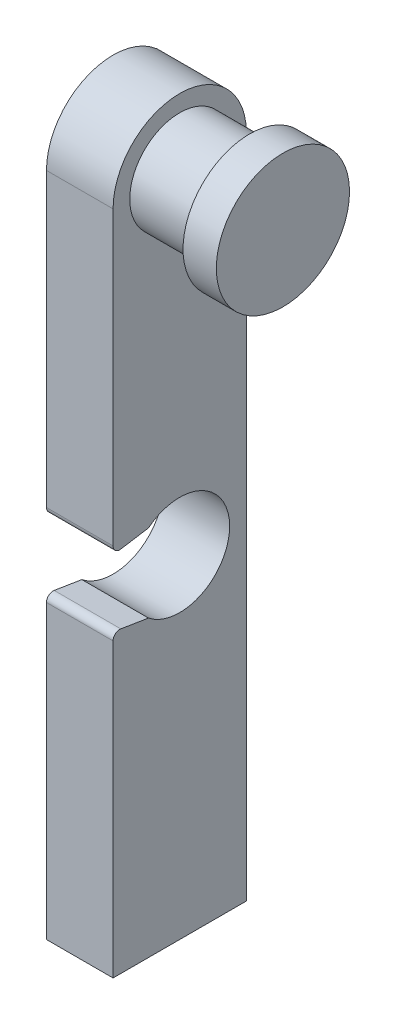
ISO-10303-21;
HEADER;
FILE_DESCRIPTION(('STEP AP214'),'2;1');
FILE_NAME('part.step','',(''),(''),'','','');
FILE_SCHEMA(('AUTOMOTIVE_DESIGN { 1 0 10303 214 1 1 1 1 }'));
ENDSEC;
DATA;
#1=APPLICATION_CONTEXT('core data for automotive mechanical design processes');
#2=APPLICATION_PROTOCOL_DEFINITION('international standard','automotive_design',2000,#1);
#3=PRODUCT_CONTEXT('',#1,'mechanical');
#4=PRODUCT('Part','Part','',(#3));
#5=PRODUCT_RELATED_PRODUCT_CATEGORY('part','',(#4));
#6=PRODUCT_DEFINITION_FORMATION('','',#4);
#7=PRODUCT_DEFINITION_CONTEXT('part definition',#1,'design');
#8=PRODUCT_DEFINITION('design','',#6,#7);
#9=PRODUCT_DEFINITION_SHAPE('','',#8);
#10=(LENGTH_UNIT() NAMED_UNIT(*) SI_UNIT(.MILLI.,.METRE.));
#11=(NAMED_UNIT(*) PLANE_ANGLE_UNIT() SI_UNIT($,.RADIAN.));
#12=(NAMED_UNIT(*) SI_UNIT($,.STERADIAN.) SOLID_ANGLE_UNIT());
#13=UNCERTAINTY_MEASURE_WITH_UNIT(LENGTH_MEASURE(1.E-05),#10,'distance_accuracy_value','');
#14=(GEOMETRIC_REPRESENTATION_CONTEXT(3) GLOBAL_UNCERTAINTY_ASSIGNED_CONTEXT((#13)) GLOBAL_UNIT_ASSIGNED_CONTEXT((#10,
#11,#12)) REPRESENTATION_CONTEXT('',''));
#15=CARTESIAN_POINT('',(0.,0.,0.));
#16=DIRECTION('',(0.,0.,1.));
#17=DIRECTION('',(1.,0.,0.));
#18=AXIS2_PLACEMENT_3D('',#15,#16,#17);
#19=CARTESIAN_POINT('',(2.,10.,2.));
#20=DIRECTION('',(0.,0.,-1.));
#21=DIRECTION('',(0.,1.,0.));
#22=AXIS2_PLACEMENT_3D('',#19,#20,#21);
#23=PLANE('',#22);
#24=DIRECTION('',(0.,-1.,0.));
#25=VECTOR('',#24,1.);
#26=CARTESIAN_POINT('',(2.,10.,2.));
#27=LINE('',#26,#25);
#28=CARTESIAN_POINT('',(2.,-1.23481195037375,2.));
#29=VERTEX_POINT('',#28);
#30=CARTESIAN_POINT('',(2.,-9.99999999999997,2.));
#31=VERTEX_POINT('',#30);
#32=EDGE_CURVE('E160',#29,#31,#27,.T.);
#33=ORIENTED_EDGE('',*,*,#32,.F.);
#34=DIRECTION('',(-1.,0.,0.));
#35=VECTOR('',#34,1.);
#36=CARTESIAN_POINT('',(2.,-1.23481195037375,2.));
#37=LINE('',#36,#35);
#38=CARTESIAN_POINT('',(0.,-1.23481195037375,2.));
#39=VERTEX_POINT('',#38);
#40=EDGE_CURVE('E186',#29,#39,#37,.T.);
#41=ORIENTED_EDGE('',*,*,#40,.T.);
#42=DIRECTION('',(0.,-1.,0.));
#43=VECTOR('',#42,1.);
#44=CARTESIAN_POINT('',(0.,10.,2.));
#45=LINE('',#44,#43);
#46=CARTESIAN_POINT('',(0.,-9.99999999999997,2.));
#47=VERTEX_POINT('',#46);
#48=EDGE_CURVE('E154',#39,#47,#45,.T.);
#49=ORIENTED_EDGE('',*,*,#48,.T.);
#50=DIRECTION('',(-1.,0.,0.));
#51=VECTOR('',#50,1.);
#52=CARTESIAN_POINT('',(2.,-9.99999999999997,2.));
#53=LINE('',#52,#51);
#54=EDGE_CURVE('E183',#31,#47,#53,.T.);
#55=ORIENTED_EDGE('',*,*,#54,.F.);
#56=EDGE_LOOP('',(#33,#41,#49,#55));
#57=FACE_BOUND('',#56,.T.);
#58=ADVANCED_FACE('F33',(#57),#23,.F.);
#59=CARTESIAN_POINT('',(2.,10.,0.));
#60=DIRECTION('',(1.,0.,0.));
#61=DIRECTION('',(0.,0.,-1.));
#62=AXIS2_PLACEMENT_3D('',#59,#60,#61);
#63=PLANE('',#62);
#64=DIRECTION('',(0.,0.159104316938012,0.987261777003287));
#65=VECTOR('',#64,1.);
#66=CARTESIAN_POINT('',(2.,-1.17130321416454,0.937042571331637));
#67=LINE('',#66,#65);
#68=CARTESIAN_POINT('',(2.,-1.17130321416454,0.937042571331637));
#69=VERTEX_POINT('',#68);
#70=CARTESIAN_POINT('',(2.,-1.03735959497309,1.7681791366124));
#71=VERTEX_POINT('',#70);
#72=EDGE_CURVE('E117',#69,#71,#67,.T.);
#73=ORIENTED_EDGE('',*,*,#72,.T.);
#74=CARTESIAN_POINT('',(2.,-1.23481195037375,1.8));
#75=DIRECTION('',(1.,0.,0.));
#76=DIRECTION('',(0.,0.,-1.));
#77=AXIS2_PLACEMENT_3D('',#74,#75,#76);
#78=CIRCLE('',#77,0.2);
#79=EDGE_CURVE('E195',#71,#29,#78,.T.);
#80=ORIENTED_EDGE('',*,*,#79,.T.);
#81=ORIENTED_EDGE('',*,*,#32,.T.);
#82=DIRECTION('',(0.,0.,-1.));
#83=VECTOR('',#82,1.);
#84=CARTESIAN_POINT('',(2.,-9.99999999999997,-2.));
#85=LINE('',#84,#83);
#86=CARTESIAN_POINT('',(2.,-9.99999999999997,-2.));
#87=VERTEX_POINT('',#86);
#88=EDGE_CURVE('E159',#31,#87,#85,.T.);
#89=ORIENTED_EDGE('',*,*,#88,.T.);
#90=DIRECTION('',(0.,1.,0.));
#91=VECTOR('',#90,1.);
#92=CARTESIAN_POINT('',(2.,10.,-2.));
#93=LINE('',#92,#91);
#94=CARTESIAN_POINT('',(2.,10.,-2.));
#95=VERTEX_POINT('',#94);
#96=EDGE_CURVE('E162',#87,#95,#93,.T.);
#97=ORIENTED_EDGE('',*,*,#96,.T.);
#98=CARTESIAN_POINT('',(2.,10.,0.));
#99=DIRECTION('',(1.,0.,0.));
#100=DIRECTION('',(0.,0.,-1.));
#101=AXIS2_PLACEMENT_3D('',#98,#99,#100);
#102=CIRCLE('',#101,2.);
#103=CARTESIAN_POINT('',(2.,10.,2.));
#104=VERTEX_POINT('',#103);
#105=EDGE_CURVE('E164',#95,#104,#102,.T.);
#106=ORIENTED_EDGE('',*,*,#105,.T.);
#107=CARTESIAN_POINT('',(2.,1.23481195037377,2.));
#108=VERTEX_POINT('',#107);
#109=EDGE_CURVE('E157',#104,#108,#27,.T.);
#110=ORIENTED_EDGE('',*,*,#109,.T.);
#111=CARTESIAN_POINT('',(2.,1.23481195037377,1.8));
#112=DIRECTION('',(1.,0.,0.));
#113=DIRECTION('',(0.,0.,-1.));
#114=AXIS2_PLACEMENT_3D('',#111,#112,#113);
#115=CIRCLE('',#114,0.2);
#116=CARTESIAN_POINT('',(2.,1.03735959497311,1.7681791366124));
#117=VERTEX_POINT('',#116);
#118=EDGE_CURVE('E48',#108,#117,#115,.T.);
#119=ORIENTED_EDGE('',*,*,#118,.T.);
#120=DIRECTION('',(0.,0.159104316938015,-0.987261777003287));
#121=VECTOR('',#120,1.);
#122=CARTESIAN_POINT('',(2.,1.00000000000001,2.));
#123=LINE('',#122,#121);
#124=CARTESIAN_POINT('',(2.,1.17130321416456,0.937042571331632));
#125=VERTEX_POINT('',#124);
#126=EDGE_CURVE('E141',#117,#125,#123,.T.);
#127=ORIENTED_EDGE('',*,*,#126,.T.);
#128=CARTESIAN_POINT('',(2.,0.,0.));
#129=DIRECTION('',(1.,0.,0.));
#130=DIRECTION('',(0.,0.,-1.));
#131=AXIS2_PLACEMENT_3D('',#128,#129,#130);
#132=CIRCLE('',#131,1.5);
#133=EDGE_CURVE('E122',#125,#69,#132,.F.);
#134=ORIENTED_EDGE('',*,*,#133,.T.);
#135=EDGE_LOOP('',(#73,#80,#81,#89,#97,#106,#110,#119,#127,#134));
#136=FACE_BOUND('',#135,.T.);
#137=CARTESIAN_POINT('',(2.,10.,0.));
#138=DIRECTION('',(1.,0.,0.));
#139=DIRECTION('',(0.,0.,-1.));
#140=AXIS2_PLACEMENT_3D('',#137,#138,#139);
#141=CIRCLE('',#140,1.5);
#142=CARTESIAN_POINT('',(2.,10.,-1.5));
#143=VERTEX_POINT('',#142);
#144=EDGE_CURVE('E148',#143,#143,#141,.T.);
#145=ORIENTED_EDGE('',*,*,#144,.F.);
#146=EDGE_LOOP('',(#145));
#147=FACE_BOUND('',#146,.T.);
#148=ADVANCED_FACE('F212',(#136,#147),#63,.T.);
#149=CARTESIAN_POINT('',(0.,10.,2.));
#150=VERTEX_POINT('',#149);
#151=CARTESIAN_POINT('',(0.,1.23481195037377,2.));
#152=VERTEX_POINT('',#151);
#153=EDGE_CURVE('E167',#150,#152,#45,.T.);
#154=ORIENTED_EDGE('',*,*,#153,.T.);
#155=DIRECTION('',(-1.,0.,0.));
#156=VECTOR('',#155,1.);
#157=CARTESIAN_POINT('',(2.,1.23481195037377,2.));
#158=LINE('',#157,#156);
#159=EDGE_CURVE('E11',#152,#108,#158,.F.);
#160=ORIENTED_EDGE('',*,*,#159,.T.);
#161=ORIENTED_EDGE('',*,*,#109,.F.);
#162=DIRECTION('',(-1.,0.,0.));
#163=VECTOR('',#162,1.);
#164=CARTESIAN_POINT('',(2.,10.,2.));
#165=LINE('',#164,#163);
#166=EDGE_CURVE('E166',#104,#150,#165,.T.);
#167=ORIENTED_EDGE('',*,*,#166,.T.);
#168=EDGE_LOOP('',(#154,#160,#161,#167));
#169=FACE_BOUND('',#168,.T.);
#170=ADVANCED_FACE('F203',(#169),#23,.F.);
#171=CARTESIAN_POINT('',(2.,-9.99999999999997,-2.));
#172=DIRECTION('',(0.,1.,0.));
#173=DIRECTION('',(0.,0.,1.));
#174=AXIS2_PLACEMENT_3D('',#171,#172,#173);
#175=PLANE('',#174);
#176=DIRECTION('',(0.,0.,-1.));
#177=VECTOR('',#176,1.);
#178=CARTESIAN_POINT('',(0.,-9.99999999999997,-2.));
#179=LINE('',#178,#177);
#180=CARTESIAN_POINT('',(0.,-9.99999999999997,-2.));
#181=VERTEX_POINT('',#180);
#182=EDGE_CURVE('E169',#47,#181,#179,.T.);
#183=ORIENTED_EDGE('',*,*,#182,.T.);
#184=DIRECTION('',(-1.,0.,0.));
#185=VECTOR('',#184,1.);
#186=CARTESIAN_POINT('',(2.,-9.99999999999997,-2.));
#187=LINE('',#186,#185);
#188=EDGE_CURVE('E180',#87,#181,#187,.T.);
#189=ORIENTED_EDGE('',*,*,#188,.F.);
#190=ORIENTED_EDGE('',*,*,#88,.F.);
#191=ORIENTED_EDGE('',*,*,#54,.T.);
#192=EDGE_LOOP('',(#183,#189,#190,#191));
#193=FACE_BOUND('',#192,.T.);
#194=ADVANCED_FACE('F222',(#193),#175,.F.);
#195=CARTESIAN_POINT('',(2.,10.,-2.));
#196=DIRECTION('',(0.,0.,1.));
#197=DIRECTION('',(0.,-1.,0.));
#198=AXIS2_PLACEMENT_3D('',#195,#196,#197);
#199=PLANE('',#198);
#200=DIRECTION('',(0.,1.,0.));
#201=VECTOR('',#200,1.);
#202=CARTESIAN_POINT('',(0.,10.,-2.));
#203=LINE('',#202,#201);
#204=CARTESIAN_POINT('',(0.,10.,-2.));
#205=VERTEX_POINT('',#204);
#206=EDGE_CURVE('E171',#181,#205,#203,.T.);
#207=ORIENTED_EDGE('',*,*,#206,.T.);
#208=DIRECTION('',(-1.,0.,0.));
#209=VECTOR('',#208,1.);
#210=CARTESIAN_POINT('',(2.,10.,-2.));
#211=LINE('',#210,#209);
#212=EDGE_CURVE('E177',#95,#205,#211,.T.);
#213=ORIENTED_EDGE('',*,*,#212,.F.);
#214=ORIENTED_EDGE('',*,*,#96,.F.);
#215=ORIENTED_EDGE('',*,*,#188,.T.);
#216=EDGE_LOOP('',(#207,#213,#214,#215));
#217=FACE_BOUND('',#216,.T.);
#218=ADVANCED_FACE('F226',(#217),#199,.F.);
#219=CARTESIAN_POINT('',(2.,10.,0.));
#220=DIRECTION('',(-1.,0.,0.));
#221=DIRECTION('',(0.,0.,1.));
#222=AXIS2_PLACEMENT_3D('',#219,#220,#221);
#223=CYLINDRICAL_SURFACE('',#222,2.);
#224=CARTESIAN_POINT('',(0.,10.,0.));
#225=DIRECTION('',(1.,0.,0.));
#226=DIRECTION('',(0.,0.,-1.));
#227=AXIS2_PLACEMENT_3D('',#224,#225,#226);
#228=CIRCLE('',#227,2.);
#229=EDGE_CURVE('E173',#205,#150,#228,.T.);
#230=ORIENTED_EDGE('',*,*,#229,.T.);
#231=ORIENTED_EDGE('',*,*,#166,.F.);
#232=ORIENTED_EDGE('',*,*,#105,.F.);
#233=ORIENTED_EDGE('',*,*,#212,.T.);
#234=EDGE_LOOP('',(#230,#231,#232,#233));
#235=FACE_BOUND('',#234,.T.);
#236=ADVANCED_FACE('F231',(#235),#223,.T.);
#237=CARTESIAN_POINT('',(0.,10.,0.));
#238=DIRECTION('',(1.,0.,0.));
#239=DIRECTION('',(0.,0.,-1.));
#240=AXIS2_PLACEMENT_3D('',#237,#238,#239);
#241=PLANE('',#240);
#242=ORIENTED_EDGE('',*,*,#48,.F.);
#243=CARTESIAN_POINT('',(0.,-1.23481195037375,1.8));
#244=DIRECTION('',(1.,0.,0.));
#245=DIRECTION('',(0.,0.,-1.));
#246=AXIS2_PLACEMENT_3D('',#243,#244,#245);
#247=CIRCLE('',#246,0.2);
#248=CARTESIAN_POINT('',(0.,-1.03735959497309,1.7681791366124));
#249=VERTEX_POINT('',#248);
#250=EDGE_CURVE('E135',#39,#249,#247,.F.);
#251=ORIENTED_EDGE('',*,*,#250,.T.);
#252=DIRECTION('',(0.,0.159104316938012,0.987261777003287));
#253=VECTOR('',#252,1.);
#254=CARTESIAN_POINT('',(0.,-1.17130321416454,0.937042571331637));
#255=LINE('',#254,#253);
#256=CARTESIAN_POINT('',(0.,-1.17130321416454,0.937042571331637));
#257=VERTEX_POINT('',#256);
#258=EDGE_CURVE('E114',#257,#249,#255,.T.);
#259=ORIENTED_EDGE('',*,*,#258,.F.);
#260=CARTESIAN_POINT('',(0.,0.,0.));
#261=DIRECTION('',(-1.,0.,0.));
#262=DIRECTION('',(0.,0.,-1.));
#263=AXIS2_PLACEMENT_3D('',#260,#261,#262);
#264=CIRCLE('',#263,1.5);
#265=CARTESIAN_POINT('',(0.,1.17130321416455,0.937042571331627));
#266=VERTEX_POINT('',#265);
#267=EDGE_CURVE('E126',#266,#257,#264,.T.);
#268=ORIENTED_EDGE('',*,*,#267,.F.);
#269=DIRECTION('',(0.,0.159104316938015,-0.987261777003287));
#270=VECTOR('',#269,1.);
#271=CARTESIAN_POINT('',(0.,1.00000000000001,2.));
#272=LINE('',#271,#270);
#273=CARTESIAN_POINT('',(0.,1.03735959497311,1.7681791366124));
#274=VERTEX_POINT('',#273);
#275=EDGE_CURVE('E136',#274,#266,#272,.T.);
#276=ORIENTED_EDGE('',*,*,#275,.F.);
#277=CARTESIAN_POINT('',(0.,1.23481195037377,1.8));
#278=DIRECTION('',(1.,0.,0.));
#279=DIRECTION('',(0.,0.,-1.));
#280=AXIS2_PLACEMENT_3D('',#277,#278,#279);
#281=CIRCLE('',#280,0.2);
#282=EDGE_CURVE('E189',#274,#152,#281,.F.);
#283=ORIENTED_EDGE('',*,*,#282,.T.);
#284=ORIENTED_EDGE('',*,*,#153,.F.);
#285=ORIENTED_EDGE('',*,*,#229,.F.);
#286=ORIENTED_EDGE('',*,*,#206,.F.);
#287=ORIENTED_EDGE('',*,*,#182,.F.);
#288=EDGE_LOOP('',(#242,#251,#259,#268,#276,#283,#284,#285,#286,#287));
#289=FACE_BOUND('',#288,.T.);
#290=ADVANCED_FACE('F134',(#289),#241,.F.);
#291=CARTESIAN_POINT('',(4.1,10.,0.));
#292=DIRECTION('',(-1.,0.,0.));
#293=DIRECTION('',(0.,0.,1.));
#294=AXIS2_PLACEMENT_3D('',#291,#292,#293);
#295=CYLINDRICAL_SURFACE('',#294,1.5);
#296=CARTESIAN_POINT('',(4.1,10.,0.));
#297=DIRECTION('',(1.,0.,0.));
#298=DIRECTION('',(0.,0.,-1.));
#299=AXIS2_PLACEMENT_3D('',#296,#297,#298);
#300=CIRCLE('',#299,1.5);
#301=CARTESIAN_POINT('',(4.1,10.,-1.5));
#302=VERTEX_POINT('',#301);
#303=EDGE_CURVE('E151',#302,#302,#300,.T.);
#304=ORIENTED_EDGE('',*,*,#303,.F.);
#305=EDGE_LOOP('',(#304));
#306=FACE_BOUND('',#305,.T.);
#307=ORIENTED_EDGE('',*,*,#144,.T.);
#308=EDGE_LOOP('',(#307));
#309=FACE_BOUND('',#308,.T.);
#310=ADVANCED_FACE('F239',(#306,#309),#295,.T.);
#311=CARTESIAN_POINT('',(4.1,10.,0.));
#312=DIRECTION('',(1.,0.,0.));
#313=DIRECTION('',(0.,0.,-1.));
#314=AXIS2_PLACEMENT_3D('',#311,#312,#313);
#315=PLANE('',#314);
#316=CARTESIAN_POINT('',(4.1,10.,0.));
#317=DIRECTION('',(1.,0.,0.));
#318=DIRECTION('',(0.,0.,-1.));
#319=AXIS2_PLACEMENT_3D('',#316,#317,#318);
#320=CIRCLE('',#319,2.);
#321=CARTESIAN_POINT('',(4.1,10.,-2.));
#322=VERTEX_POINT('',#321);
#323=EDGE_CURVE('E121',#322,#322,#320,.T.);
#324=ORIENTED_EDGE('',*,*,#323,.F.);
#325=EDGE_LOOP('',(#324));
#326=FACE_BOUND('',#325,.T.);
#327=ORIENTED_EDGE('',*,*,#303,.T.);
#328=EDGE_LOOP('',(#327));
#329=FACE_BOUND('',#328,.T.);
#330=ADVANCED_FACE('F243',(#326,#329),#315,.F.);
#331=CARTESIAN_POINT('',(5.1,10.,0.));
#332=DIRECTION('',(-1.,0.,0.));
#333=DIRECTION('',(0.,0.,1.));
#334=AXIS2_PLACEMENT_3D('',#331,#332,#333);
#335=CYLINDRICAL_SURFACE('',#334,2.);
#336=CARTESIAN_POINT('',(5.1,10.,0.));
#337=DIRECTION('',(1.,0.,0.));
#338=DIRECTION('',(0.,0.,-1.));
#339=AXIS2_PLACEMENT_3D('',#336,#337,#338);
#340=CIRCLE('',#339,2.);
#341=CARTESIAN_POINT('',(5.1,10.,-2.));
#342=VERTEX_POINT('',#341);
#343=EDGE_CURVE('E145',#342,#342,#340,.T.);
#344=ORIENTED_EDGE('',*,*,#343,.F.);
#345=EDGE_LOOP('',(#344));
#346=FACE_BOUND('',#345,.T.);
#347=ORIENTED_EDGE('',*,*,#323,.T.);
#348=EDGE_LOOP('',(#347));
#349=FACE_BOUND('',#348,.T.);
#350=ADVANCED_FACE('F245',(#346,#349),#335,.T.);
#351=CARTESIAN_POINT('',(5.1,10.,0.));
#352=DIRECTION('',(1.,0.,0.));
#353=DIRECTION('',(0.,0.,-1.));
#354=AXIS2_PLACEMENT_3D('',#351,#352,#353);
#355=PLANE('',#354);
#356=ORIENTED_EDGE('',*,*,#343,.T.);
#357=EDGE_LOOP('',(#356));
#358=FACE_BOUND('',#357,.T.);
#359=ADVANCED_FACE('F248',(#358),#355,.T.);
#360=CARTESIAN_POINT('',(6.60977222864645,-1.17130321416454,0.937042571331637));
#361=DIRECTION('',(0.,-0.987261777003287,0.159104316938012));
#362=DIRECTION('',(0.,-0.159104316938012,-0.987261777003287));
#363=AXIS2_PLACEMENT_3D('',#360,#361,#362);
#364=PLANE('',#363);
#365=ORIENTED_EDGE('',*,*,#258,.T.);
#366=DIRECTION('',(-1.,0.,0.));
#367=VECTOR('',#366,1.);
#368=CARTESIAN_POINT('',(6.60977222864645,-1.03735959497309,1.7681791366124));
#369=LINE('',#368,#367);
#370=EDGE_CURVE('E192',#249,#71,#369,.F.);
#371=ORIENTED_EDGE('',*,*,#370,.T.);
#372=ORIENTED_EDGE('',*,*,#72,.F.);
#373=DIRECTION('',(-1.,0.,0.));
#374=VECTOR('',#373,1.);
#375=CARTESIAN_POINT('',(6.60977222864645,-1.17130321416454,0.937042571331637));
#376=LINE('',#375,#374);
#377=EDGE_CURVE('E110',#69,#257,#376,.T.);
#378=ORIENTED_EDGE('',*,*,#377,.T.);
#379=EDGE_LOOP('',(#365,#371,#372,#378));
#380=FACE_BOUND('',#379,.T.);
#381=ADVANCED_FACE('F112',(#380),#364,.F.);
#382=CARTESIAN_POINT('',(6.60977222864645,1.00000000000001,2.));
#383=DIRECTION('',(0.,0.987261777003287,0.159104316938015));
#384=DIRECTION('',(0.,-0.159104316938015,0.987261777003287));
#385=AXIS2_PLACEMENT_3D('',#382,#383,#384);
#386=PLANE('',#385);
#387=ORIENTED_EDGE('',*,*,#126,.F.);
#388=DIRECTION('',(-1.,0.,0.));
#389=VECTOR('',#388,1.);
#390=CARTESIAN_POINT('',(6.60977222864645,1.03735959497311,1.7681791366124));
#391=LINE('',#390,#389);
#392=EDGE_CURVE('E41',#117,#274,#391,.T.);
#393=ORIENTED_EDGE('',*,*,#392,.T.);
#394=ORIENTED_EDGE('',*,*,#275,.T.);
#395=DIRECTION('',(-1.,0.,0.));
#396=VECTOR('',#395,1.);
#397=CARTESIAN_POINT('',(6.60977222864645,1.17130321416456,0.937042571331632));
#398=LINE('',#397,#396);
#399=EDGE_CURVE('E129',#125,#266,#398,.T.);
#400=ORIENTED_EDGE('',*,*,#399,.F.);
#401=EDGE_LOOP('',(#387,#393,#394,#400));
#402=FACE_BOUND('',#401,.T.);
#403=ADVANCED_FACE('F199',(#402),#386,.F.);
#404=CARTESIAN_POINT('',(6.60977222864645,0.,0.));
#405=DIRECTION('',(-1.,0.,0.));
#406=DIRECTION('',(0.,0.,1.));
#407=AXIS2_PLACEMENT_3D('',#404,#405,#406);
#408=CYLINDRICAL_SURFACE('',#407,1.5);
#409=ORIENTED_EDGE('',*,*,#399,.T.);
#410=ORIENTED_EDGE('',*,*,#267,.T.);
#411=ORIENTED_EDGE('',*,*,#377,.F.);
#412=ORIENTED_EDGE('',*,*,#133,.F.);
#413=EDGE_LOOP('',(#409,#410,#411,#412));
#414=FACE_BOUND('',#413,.T.);
#415=ADVANCED_FACE('F127',(#414),#408,.F.);
#416=CARTESIAN_POINT('',(2.,-1.23481195037375,1.8));
#417=DIRECTION('',(-1.,0.,0.));
#418=DIRECTION('',(0.,0.,1.));
#419=AXIS2_PLACEMENT_3D('',#416,#417,#418);
#420=CYLINDRICAL_SURFACE('',#419,0.2);
#421=ORIENTED_EDGE('',*,*,#79,.F.);
#422=ORIENTED_EDGE('',*,*,#370,.F.);
#423=ORIENTED_EDGE('',*,*,#250,.F.);
#424=ORIENTED_EDGE('',*,*,#40,.F.);
#425=EDGE_LOOP('',(#421,#422,#423,#424));
#426=FACE_BOUND('',#425,.T.);
#427=ADVANCED_FACE('F206',(#426),#420,.T.);
#428=CARTESIAN_POINT('',(6.60977222864645,1.23481195037377,1.8));
#429=DIRECTION('',(-1.,0.,0.));
#430=DIRECTION('',(0.,0.,1.));
#431=AXIS2_PLACEMENT_3D('',#428,#429,#430);
#432=CYLINDRICAL_SURFACE('',#431,0.2);
#433=ORIENTED_EDGE('',*,*,#118,.F.);
#434=ORIENTED_EDGE('',*,*,#159,.F.);
#435=ORIENTED_EDGE('',*,*,#282,.F.);
#436=ORIENTED_EDGE('',*,*,#392,.F.);
#437=EDGE_LOOP('',(#433,#434,#435,#436));
#438=FACE_BOUND('',#437,.T.);
#439=ADVANCED_FACE('F35',(#438),#432,.T.);
#440=CLOSED_SHELL('',(#58,#148,#170,#194,#218,#236,#290,#310,#330,#350,#359,#381,#403,#415,#427,#439));
#441=MANIFOLD_SOLID_BREP('B2',#440);
#442=ADVANCED_BREP_SHAPE_REPRESENTATION('',(#18,#441),#14);
#443=SHAPE_DEFINITION_REPRESENTATION(#9,#442);
ENDSEC;
END-ISO-10303-21;
